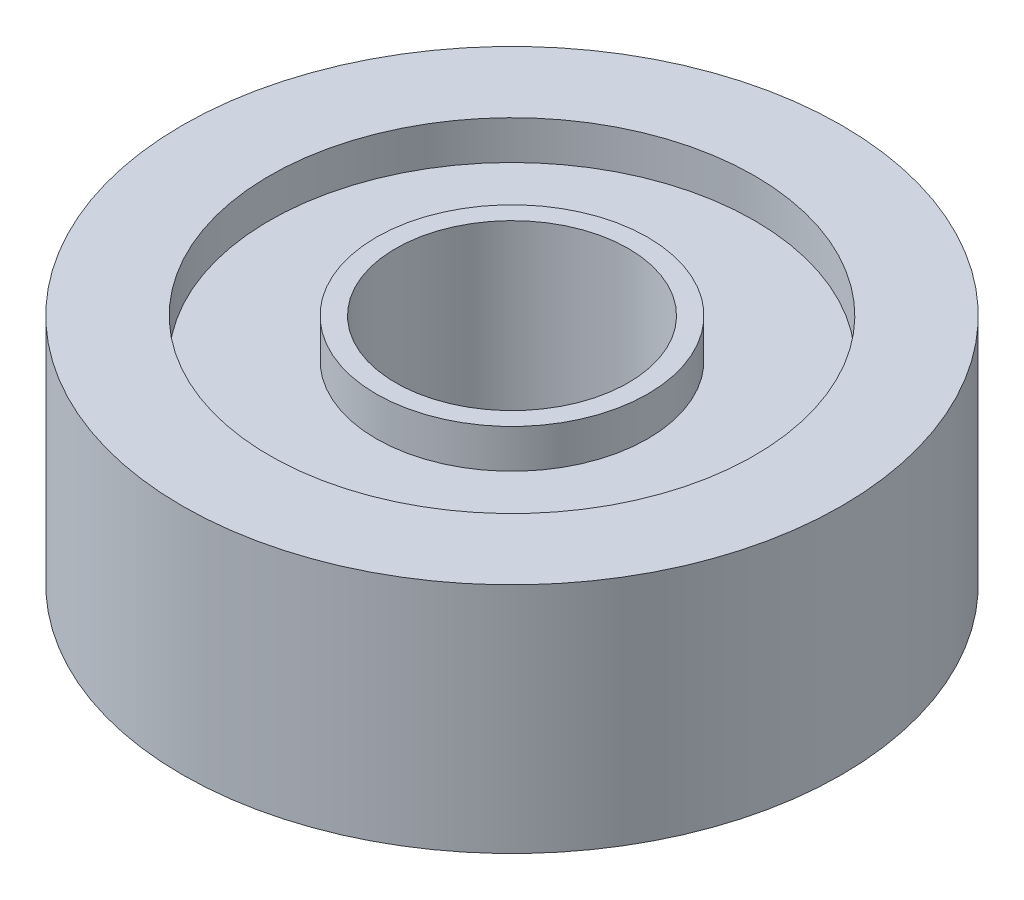
ISO-10303-21;
HEADER;
FILE_DESCRIPTION(('STEP AP214'),'2;1');
FILE_NAME('part.step','',(''),(''),'','','');
FILE_SCHEMA(('AUTOMOTIVE_DESIGN { 1 0 10303 214 1 1 1 1 }'));
ENDSEC;
DATA;
#1=APPLICATION_CONTEXT('core data for automotive mechanical design processes');
#2=APPLICATION_PROTOCOL_DEFINITION('international standard','automotive_design',2000,#1);
#3=PRODUCT_CONTEXT('',#1,'mechanical');
#4=PRODUCT('Part','Part','',(#3));
#5=PRODUCT_RELATED_PRODUCT_CATEGORY('part','',(#4));
#6=PRODUCT_DEFINITION_FORMATION('','',#4);
#7=PRODUCT_DEFINITION_CONTEXT('part definition',#1,'design');
#8=PRODUCT_DEFINITION('design','',#6,#7);
#9=PRODUCT_DEFINITION_SHAPE('','',#8);
#10=(LENGTH_UNIT() NAMED_UNIT(*) SI_UNIT(.MILLI.,.METRE.));
#11=(NAMED_UNIT(*) PLANE_ANGLE_UNIT() SI_UNIT($,.RADIAN.));
#12=(NAMED_UNIT(*) SI_UNIT($,.STERADIAN.) SOLID_ANGLE_UNIT());
#13=UNCERTAINTY_MEASURE_WITH_UNIT(LENGTH_MEASURE(1.E-05),#10,'distance_accuracy_value','');
#14=(GEOMETRIC_REPRESENTATION_CONTEXT(3) GLOBAL_UNCERTAINTY_ASSIGNED_CONTEXT((#13)) GLOBAL_UNIT_ASSIGNED_CONTEXT((#10,
#11,#12)) REPRESENTATION_CONTEXT('',''));
#15=CARTESIAN_POINT('',(0.,0.,0.));
#16=DIRECTION('',(0.,0.,1.));
#17=DIRECTION('',(1.,0.,0.));
#18=AXIS2_PLACEMENT_3D('',#15,#16,#17);
#19=CARTESIAN_POINT('',(-8.5,0.,0.));
#20=DIRECTION('',(0.,1.,0.));
#21=DIRECTION('',(0.,0.,1.));
#22=AXIS2_PLACEMENT_3D('',#19,#20,#21);
#23=PLANE('',#22);
#24=CARTESIAN_POINT('',(0.,0.,0.));
#25=DIRECTION('',(0.,-1.,0.));
#26=DIRECTION('',(0.,0.,-1.));
#27=AXIS2_PLACEMENT_3D('',#24,#25,#26);
#28=CIRCLE('',#27,3.);
#29=CARTESIAN_POINT('',(0.,0.,-3.));
#30=VERTEX_POINT('',#29);
#31=EDGE_CURVE('E10',#30,#30,#28,.T.);
#32=ORIENTED_EDGE('',*,*,#31,.F.);
#33=EDGE_LOOP('',(#32));
#34=FACE_BOUND('',#33,.T.);
#35=CARTESIAN_POINT('',(0.,0.,0.));
#36=DIRECTION('',(0.,-1.,0.));
#37=DIRECTION('',(0.,0.,-1.));
#38=AXIS2_PLACEMENT_3D('',#35,#36,#37);
#39=CIRCLE('',#38,8.5);
#40=CARTESIAN_POINT('',(0.,0.,-8.5));
#41=VERTEX_POINT('',#40);
#42=EDGE_CURVE('E61',#41,#41,#39,.T.);
#43=ORIENTED_EDGE('',*,*,#42,.T.);
#44=EDGE_LOOP('',(#43));
#45=FACE_BOUND('',#44,.T.);
#46=ADVANCED_FACE('F33',(#34,#45),#23,.F.);
#47=CARTESIAN_POINT('',(0.,0.,0.));
#48=DIRECTION('',(0.,-1.,0.));
#49=DIRECTION('',(0.,0.,-1.));
#50=AXIS2_PLACEMENT_3D('',#47,#48,#49);
#51=CYLINDRICAL_SURFACE('',#50,3.);
#52=CARTESIAN_POINT('',(0.,6.,0.));
#53=DIRECTION('',(0.,-1.,0.));
#54=DIRECTION('',(0.,0.,-1.));
#55=AXIS2_PLACEMENT_3D('',#52,#53,#54);
#56=CIRCLE('',#55,3.);
#57=CARTESIAN_POINT('',(0.,6.,-3.));
#58=VERTEX_POINT('',#57);
#59=EDGE_CURVE('E39',#58,#58,#56,.T.);
#60=ORIENTED_EDGE('',*,*,#59,.F.);
#61=EDGE_LOOP('',(#60));
#62=FACE_BOUND('',#61,.T.);
#63=ORIENTED_EDGE('',*,*,#31,.T.);
#64=EDGE_LOOP('',(#63));
#65=FACE_BOUND('',#64,.T.);
#66=ADVANCED_FACE('F98',(#62,#65),#51,.F.);
#67=CARTESIAN_POINT('',(-3.,6.,0.));
#68=DIRECTION('',(0.,-1.,0.));
#69=DIRECTION('',(0.,0.,-1.));
#70=AXIS2_PLACEMENT_3D('',#67,#68,#69);
#71=PLANE('',#70);
#72=CARTESIAN_POINT('',(0.,6.,0.));
#73=DIRECTION('',(0.,-1.,0.));
#74=DIRECTION('',(0.,0.,-1.));
#75=AXIS2_PLACEMENT_3D('',#72,#73,#74);
#76=CIRCLE('',#75,3.5);
#77=CARTESIAN_POINT('',(0.,6.,-3.5));
#78=VERTEX_POINT('',#77);
#79=EDGE_CURVE('E43',#78,#78,#76,.T.);
#80=ORIENTED_EDGE('',*,*,#79,.F.);
#81=EDGE_LOOP('',(#80));
#82=FACE_BOUND('',#81,.T.);
#83=ORIENTED_EDGE('',*,*,#59,.T.);
#84=EDGE_LOOP('',(#83));
#85=FACE_BOUND('',#84,.T.);
#86=ADVANCED_FACE('F93',(#82,#85),#71,.F.);
#87=CARTESIAN_POINT('',(0.,0.,0.));
#88=DIRECTION('',(0.,-1.,0.));
#89=DIRECTION('',(0.,0.,-1.));
#90=AXIS2_PLACEMENT_3D('',#87,#88,#89);
#91=CYLINDRICAL_SURFACE('',#90,3.5);
#92=CARTESIAN_POINT('',(0.,5.,0.));
#93=DIRECTION('',(0.,-1.,0.));
#94=DIRECTION('',(0.,0.,-1.));
#95=AXIS2_PLACEMENT_3D('',#92,#93,#94);
#96=CIRCLE('',#95,3.5);
#97=CARTESIAN_POINT('',(0.,5.,-3.5));
#98=VERTEX_POINT('',#97);
#99=EDGE_CURVE('E47',#98,#98,#96,.T.);
#100=ORIENTED_EDGE('',*,*,#99,.F.);
#101=EDGE_LOOP('',(#100));
#102=FACE_BOUND('',#101,.T.);
#103=ORIENTED_EDGE('',*,*,#79,.T.);
#104=EDGE_LOOP('',(#103));
#105=FACE_BOUND('',#104,.T.);
#106=ADVANCED_FACE('F87',(#102,#105),#91,.T.);
#107=CARTESIAN_POINT('',(-3.5,5.,0.));
#108=DIRECTION('',(0.,-1.,0.));
#109=DIRECTION('',(0.,0.,-1.));
#110=AXIS2_PLACEMENT_3D('',#107,#108,#109);
#111=PLANE('',#110);
#112=CARTESIAN_POINT('',(0.,5.,0.));
#113=DIRECTION('',(0.,-1.,0.));
#114=DIRECTION('',(0.,0.,-1.));
#115=AXIS2_PLACEMENT_3D('',#112,#113,#114);
#116=CIRCLE('',#115,6.25);
#117=CARTESIAN_POINT('',(0.,5.,-6.25));
#118=VERTEX_POINT('',#117);
#119=EDGE_CURVE('E52',#118,#118,#116,.T.);
#120=ORIENTED_EDGE('',*,*,#119,.F.);
#121=EDGE_LOOP('',(#120));
#122=FACE_BOUND('',#121,.T.);
#123=ORIENTED_EDGE('',*,*,#99,.T.);
#124=EDGE_LOOP('',(#123));
#125=FACE_BOUND('',#124,.T.);
#126=ADVANCED_FACE('F81',(#122,#125),#111,.F.);
#127=CARTESIAN_POINT('',(0.,0.,0.));
#128=DIRECTION('',(0.,-1.,0.));
#129=DIRECTION('',(0.,0.,-1.));
#130=AXIS2_PLACEMENT_3D('',#127,#128,#129);
#131=CYLINDRICAL_SURFACE('',#130,6.25);
#132=CARTESIAN_POINT('',(0.,6.,0.));
#133=DIRECTION('',(0.,-1.,0.));
#134=DIRECTION('',(0.,0.,-1.));
#135=AXIS2_PLACEMENT_3D('',#132,#133,#134);
#136=CIRCLE('',#135,6.25);
#137=CARTESIAN_POINT('',(0.,6.,-6.25));
#138=VERTEX_POINT('',#137);
#139=EDGE_CURVE('E55',#138,#138,#136,.T.);
#140=ORIENTED_EDGE('',*,*,#139,.F.);
#141=EDGE_LOOP('',(#140));
#142=FACE_BOUND('',#141,.T.);
#143=ORIENTED_EDGE('',*,*,#119,.T.);
#144=EDGE_LOOP('',(#143));
#145=FACE_BOUND('',#144,.T.);
#146=ADVANCED_FACE('F75',(#142,#145),#131,.F.);
#147=CARTESIAN_POINT('',(-6.25,6.,0.));
#148=DIRECTION('',(0.,-1.,0.));
#149=DIRECTION('',(0.,0.,-1.));
#150=AXIS2_PLACEMENT_3D('',#147,#148,#149);
#151=PLANE('',#150);
#152=CARTESIAN_POINT('',(0.,6.,0.));
#153=DIRECTION('',(0.,-1.,0.));
#154=DIRECTION('',(0.,0.,-1.));
#155=AXIS2_PLACEMENT_3D('',#152,#153,#154);
#156=CIRCLE('',#155,8.5);
#157=CARTESIAN_POINT('',(0.,6.,-8.5));
#158=VERTEX_POINT('',#157);
#159=EDGE_CURVE('E58',#158,#158,#156,.T.);
#160=ORIENTED_EDGE('',*,*,#159,.F.);
#161=EDGE_LOOP('',(#160));
#162=FACE_BOUND('',#161,.T.);
#163=ORIENTED_EDGE('',*,*,#139,.T.);
#164=EDGE_LOOP('',(#163));
#165=FACE_BOUND('',#164,.T.);
#166=ADVANCED_FACE('F69',(#162,#165),#151,.F.);
#167=CARTESIAN_POINT('',(0.,0.,0.));
#168=DIRECTION('',(0.,-1.,0.));
#169=DIRECTION('',(0.,0.,-1.));
#170=AXIS2_PLACEMENT_3D('',#167,#168,#169);
#171=CYLINDRICAL_SURFACE('',#170,8.5);
#172=ORIENTED_EDGE('',*,*,#42,.F.);
#173=EDGE_LOOP('',(#172));
#174=FACE_BOUND('',#173,.T.);
#175=ORIENTED_EDGE('',*,*,#159,.T.);
#176=EDGE_LOOP('',(#175));
#177=FACE_BOUND('',#176,.T.);
#178=ADVANCED_FACE('F66',(#174,#177),#171,.T.);
#179=CLOSED_SHELL('',(#46,#66,#86,#106,#126,#146,#166,#178));
#180=MANIFOLD_SOLID_BREP('B2',#179);
#181=ADVANCED_BREP_SHAPE_REPRESENTATION('',(#18,#180),#14);
#182=SHAPE_DEFINITION_REPRESENTATION(#9,#181);
ENDSEC;
END-ISO-10303-21;
